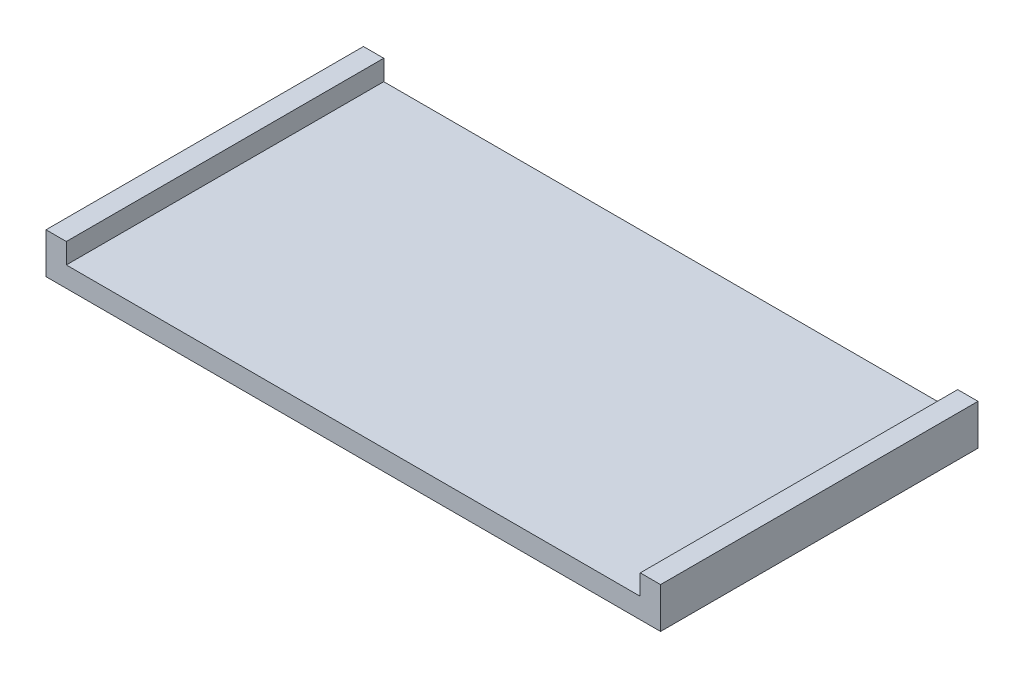
ISO-10303-21;
HEADER;
FILE_DESCRIPTION(('STEP AP214'),'2;1');
FILE_NAME('part.step','',(''),(''),'','','');
FILE_SCHEMA(('AUTOMOTIVE_DESIGN { 1 0 10303 214 1 1 1 1 }'));
ENDSEC;
DATA;
#1=APPLICATION_CONTEXT('core data for automotive mechanical design processes');
#2=APPLICATION_PROTOCOL_DEFINITION('international standard','automotive_design',2000,#1);
#3=PRODUCT_CONTEXT('',#1,'mechanical');
#4=PRODUCT('Part','Part','',(#3));
#5=PRODUCT_RELATED_PRODUCT_CATEGORY('part','',(#4));
#6=PRODUCT_DEFINITION_FORMATION('','',#4);
#7=PRODUCT_DEFINITION_CONTEXT('part definition',#1,'design');
#8=PRODUCT_DEFINITION('design','',#6,#7);
#9=PRODUCT_DEFINITION_SHAPE('','',#8);
#10=(LENGTH_UNIT() NAMED_UNIT(*) SI_UNIT(.MILLI.,.METRE.));
#11=(NAMED_UNIT(*) PLANE_ANGLE_UNIT() SI_UNIT($,.RADIAN.));
#12=(NAMED_UNIT(*) SI_UNIT($,.STERADIAN.) SOLID_ANGLE_UNIT());
#13=UNCERTAINTY_MEASURE_WITH_UNIT(LENGTH_MEASURE(1.E-05),#10,'distance_accuracy_value','');
#14=(GEOMETRIC_REPRESENTATION_CONTEXT(3) GLOBAL_UNCERTAINTY_ASSIGNED_CONTEXT((#13)) GLOBAL_UNIT_ASSIGNED_CONTEXT((#10,
#11,#12)) REPRESENTATION_CONTEXT('',''));
#15=CARTESIAN_POINT('',(0.,0.,0.));
#16=DIRECTION('',(0.,0.,1.));
#17=DIRECTION('',(1.,0.,0.));
#18=AXIS2_PLACEMENT_3D('',#15,#16,#17);
#19=CARTESIAN_POINT('',(-24.2,1.6,0.));
#20=DIRECTION('',(0.,-1.,0.));
#21=DIRECTION('',(0.,0.,-1.));
#22=AXIS2_PLACEMENT_3D('',#19,#20,#21);
#23=PLANE('',#22);
#24=DIRECTION('',(0.,0.,1.));
#25=VECTOR('',#24,1.);
#26=CARTESIAN_POINT('',(22.6,1.6,0.));
#27=LINE('',#26,#25);
#28=CARTESIAN_POINT('',(22.6,1.6,-25.));
#29=VERTEX_POINT('',#28);
#30=CARTESIAN_POINT('',(22.6,1.6,0.));
#31=VERTEX_POINT('',#30);
#32=EDGE_CURVE('E119',#29,#31,#27,.T.);
#33=ORIENTED_EDGE('',*,*,#32,.F.);
#34=DIRECTION('',(-1.,0.,0.));
#35=VECTOR('',#34,1.);
#36=CARTESIAN_POINT('',(-24.2,1.6,-25.));
#37=LINE('',#36,#35);
#38=CARTESIAN_POINT('',(-22.6,1.6,-25.));
#39=VERTEX_POINT('',#38);
#40=EDGE_CURVE('E37',#29,#39,#37,.T.);
#41=ORIENTED_EDGE('',*,*,#40,.T.);
#42=DIRECTION('',(0.,0.,-1.));
#43=VECTOR('',#42,1.);
#44=CARTESIAN_POINT('',(-22.6,1.6,-25.));
#45=LINE('',#44,#43);
#46=CARTESIAN_POINT('',(-22.6,1.6,0.));
#47=VERTEX_POINT('',#46);
#48=EDGE_CURVE('E56',#47,#39,#45,.T.);
#49=ORIENTED_EDGE('',*,*,#48,.F.);
#50=DIRECTION('',(1.,0.,0.));
#51=VECTOR('',#50,1.);
#52=CARTESIAN_POINT('',(0.,1.6,0.));
#53=LINE('',#52,#51);
#54=EDGE_CURVE('E51',#47,#31,#53,.T.);
#55=ORIENTED_EDGE('',*,*,#54,.T.);
#56=EDGE_LOOP('',(#33,#41,#49,#55));
#57=FACE_BOUND('',#56,.T.);
#58=ADVANCED_FACE('F33',(#57),#23,.F.);
#59=CARTESIAN_POINT('',(0.,1.6,0.));
#60=DIRECTION('',(0.,0.,-1.));
#61=DIRECTION('',(-1.,0.,0.));
#62=AXIS2_PLACEMENT_3D('',#59,#60,#61);
#63=PLANE('',#62);
#64=DIRECTION('',(1.,0.,0.));
#65=VECTOR('',#64,1.);
#66=CARTESIAN_POINT('',(0.,0.,0.));
#67=LINE('',#66,#65);
#68=CARTESIAN_POINT('',(-24.2,0.,0.));
#69=VERTEX_POINT('',#68);
#70=CARTESIAN_POINT('',(24.2,0.,0.));
#71=VERTEX_POINT('',#70);
#72=EDGE_CURVE('E104',#69,#71,#67,.T.);
#73=ORIENTED_EDGE('',*,*,#72,.T.);
#74=DIRECTION('',(0.,-1.,0.));
#75=VECTOR('',#74,1.);
#76=CARTESIAN_POINT('',(24.2,1.6,0.));
#77=LINE('',#76,#75);
#78=CARTESIAN_POINT('',(24.2,3.2,0.));
#79=VERTEX_POINT('',#78);
#80=EDGE_CURVE('E11',#79,#71,#77,.T.);
#81=ORIENTED_EDGE('',*,*,#80,.F.);
#82=DIRECTION('',(1.,0.,0.));
#83=VECTOR('',#82,1.);
#84=CARTESIAN_POINT('',(24.2,3.2,0.));
#85=LINE('',#84,#83);
#86=CARTESIAN_POINT('',(22.6,3.2,0.));
#87=VERTEX_POINT('',#86);
#88=EDGE_CURVE('E102',#87,#79,#85,.T.);
#89=ORIENTED_EDGE('',*,*,#88,.F.);
#90=DIRECTION('',(0.,-1.,0.));
#91=VECTOR('',#90,1.);
#92=CARTESIAN_POINT('',(22.6,3.2,0.));
#93=LINE('',#92,#91);
#94=EDGE_CURVE('E124',#87,#31,#93,.T.);
#95=ORIENTED_EDGE('',*,*,#94,.T.);
#96=ORIENTED_EDGE('',*,*,#54,.F.);
#97=DIRECTION('',(0.,-1.,0.));
#98=VECTOR('',#97,1.);
#99=CARTESIAN_POINT('',(-22.6,3.2,0.));
#100=LINE('',#99,#98);
#101=CARTESIAN_POINT('',(-22.6,3.2,0.));
#102=VERTEX_POINT('',#101);
#103=EDGE_CURVE('E149',#102,#47,#100,.T.);
#104=ORIENTED_EDGE('',*,*,#103,.F.);
#105=DIRECTION('',(1.,0.,0.));
#106=VECTOR('',#105,1.);
#107=CARTESIAN_POINT('',(-22.6,3.2,0.));
#108=LINE('',#107,#106);
#109=CARTESIAN_POINT('',(-24.2,3.2,0.));
#110=VERTEX_POINT('',#109);
#111=EDGE_CURVE('E136',#110,#102,#108,.T.);
#112=ORIENTED_EDGE('',*,*,#111,.F.);
#113=DIRECTION('',(0.,-1.,0.));
#114=VECTOR('',#113,1.);
#115=CARTESIAN_POINT('',(-24.2,1.6,0.));
#116=LINE('',#115,#114);
#117=EDGE_CURVE('E167',#110,#69,#116,.T.);
#118=ORIENTED_EDGE('',*,*,#117,.T.);
#119=EDGE_LOOP('',(#73,#81,#89,#95,#96,#104,#112,#118));
#120=FACE_BOUND('',#119,.T.);
#121=ADVANCED_FACE('F35',(#120),#63,.F.);
#122=CARTESIAN_POINT('',(24.2,1.6,-25.));
#123=DIRECTION('',(-1.,0.,0.));
#124=DIRECTION('',(0.,0.,1.));
#125=AXIS2_PLACEMENT_3D('',#122,#123,#124);
#126=PLANE('',#125);
#127=DIRECTION('',(0.,0.,-1.));
#128=VECTOR('',#127,1.);
#129=CARTESIAN_POINT('',(24.2,0.,-25.));
#130=LINE('',#129,#128);
#131=CARTESIAN_POINT('',(24.2,0.,-25.));
#132=VERTEX_POINT('',#131);
#133=EDGE_CURVE('E157',#71,#132,#130,.T.);
#134=ORIENTED_EDGE('',*,*,#133,.T.);
#135=DIRECTION('',(0.,-1.,0.));
#136=VECTOR('',#135,1.);
#137=CARTESIAN_POINT('',(24.2,1.6,-25.));
#138=LINE('',#137,#136);
#139=CARTESIAN_POINT('',(24.2,3.2,-25.));
#140=VERTEX_POINT('',#139);
#141=EDGE_CURVE('E43',#140,#132,#138,.T.);
#142=ORIENTED_EDGE('',*,*,#141,.F.);
#143=DIRECTION('',(0.,0.,-1.));
#144=VECTOR('',#143,1.);
#145=CARTESIAN_POINT('',(24.2,3.2,0.));
#146=LINE('',#145,#144);
#147=EDGE_CURVE('E108',#79,#140,#146,.T.);
#148=ORIENTED_EDGE('',*,*,#147,.F.);
#149=ORIENTED_EDGE('',*,*,#80,.T.);
#150=EDGE_LOOP('',(#134,#142,#148,#149));
#151=FACE_BOUND('',#150,.T.);
#152=ADVANCED_FACE('F109',(#151),#126,.F.);
#153=CARTESIAN_POINT('',(-24.2,1.6,-25.));
#154=DIRECTION('',(0.,0.,1.));
#155=DIRECTION('',(1.,0.,0.));
#156=AXIS2_PLACEMENT_3D('',#153,#154,#155);
#157=PLANE('',#156);
#158=DIRECTION('',(-1.,0.,0.));
#159=VECTOR('',#158,1.);
#160=CARTESIAN_POINT('',(-24.2,0.,-25.));
#161=LINE('',#160,#159);
#162=CARTESIAN_POINT('',(-24.2,0.,-25.));
#163=VERTEX_POINT('',#162);
#164=EDGE_CURVE('E159',#132,#163,#161,.T.);
#165=ORIENTED_EDGE('',*,*,#164,.T.);
#166=DIRECTION('',(0.,-1.,0.));
#167=VECTOR('',#166,1.);
#168=CARTESIAN_POINT('',(-24.2,1.6,-25.));
#169=LINE('',#168,#167);
#170=CARTESIAN_POINT('',(-24.2,3.2,-25.));
#171=VERTEX_POINT('',#170);
#172=EDGE_CURVE('E169',#171,#163,#169,.T.);
#173=ORIENTED_EDGE('',*,*,#172,.F.);
#174=DIRECTION('',(-1.,0.,0.));
#175=VECTOR('',#174,1.);
#176=CARTESIAN_POINT('',(-24.2,3.2,-25.));
#177=LINE('',#176,#175);
#178=CARTESIAN_POINT('',(-22.6,3.2,-25.));
#179=VERTEX_POINT('',#178);
#180=EDGE_CURVE('E130',#179,#171,#177,.T.);
#181=ORIENTED_EDGE('',*,*,#180,.F.);
#182=DIRECTION('',(0.,-1.,0.));
#183=VECTOR('',#182,1.);
#184=CARTESIAN_POINT('',(-22.6,3.2,-25.));
#185=LINE('',#184,#183);
#186=EDGE_CURVE('E140',#179,#39,#185,.T.);
#187=ORIENTED_EDGE('',*,*,#186,.T.);
#188=ORIENTED_EDGE('',*,*,#40,.F.);
#189=DIRECTION('',(0.,-1.,0.));
#190=VECTOR('',#189,1.);
#191=CARTESIAN_POINT('',(22.6,3.2,-25.));
#192=LINE('',#191,#190);
#193=CARTESIAN_POINT('',(22.6,3.2,-25.));
#194=VERTEX_POINT('',#193);
#195=EDGE_CURVE('E127',#194,#29,#192,.T.);
#196=ORIENTED_EDGE('',*,*,#195,.F.);
#197=DIRECTION('',(-1.,0.,0.));
#198=VECTOR('',#197,1.);
#199=CARTESIAN_POINT('',(22.6,3.2,-25.));
#200=LINE('',#199,#198);
#201=EDGE_CURVE('E113',#140,#194,#200,.T.);
#202=ORIENTED_EDGE('',*,*,#201,.F.);
#203=ORIENTED_EDGE('',*,*,#141,.T.);
#204=EDGE_LOOP('',(#165,#173,#181,#187,#188,#196,#202,#203));
#205=FACE_BOUND('',#204,.T.);
#206=ADVANCED_FACE('F174',(#205),#157,.F.);
#207=CARTESIAN_POINT('',(-24.2,1.6,0.));
#208=DIRECTION('',(1.,0.,0.));
#209=DIRECTION('',(0.,0.,-1.));
#210=AXIS2_PLACEMENT_3D('',#207,#208,#209);
#211=PLANE('',#210);
#212=DIRECTION('',(0.,0.,1.));
#213=VECTOR('',#212,1.);
#214=CARTESIAN_POINT('',(-24.2,0.,0.));
#215=LINE('',#214,#213);
#216=EDGE_CURVE('E164',#163,#69,#215,.T.);
#217=ORIENTED_EDGE('',*,*,#216,.T.);
#218=ORIENTED_EDGE('',*,*,#117,.F.);
#219=DIRECTION('',(0.,0.,1.));
#220=VECTOR('',#219,1.);
#221=CARTESIAN_POINT('',(-24.2,3.2,-25.));
#222=LINE('',#221,#220);
#223=EDGE_CURVE('E133',#171,#110,#222,.T.);
#224=ORIENTED_EDGE('',*,*,#223,.F.);
#225=ORIENTED_EDGE('',*,*,#172,.T.);
#226=EDGE_LOOP('',(#217,#218,#224,#225));
#227=FACE_BOUND('',#226,.T.);
#228=ADVANCED_FACE('F180',(#227),#211,.F.);
#229=CARTESIAN_POINT('',(-24.2,0.,0.));
#230=DIRECTION('',(0.,-1.,0.));
#231=DIRECTION('',(0.,0.,-1.));
#232=AXIS2_PLACEMENT_3D('',#229,#230,#231);
#233=PLANE('',#232);
#234=ORIENTED_EDGE('',*,*,#72,.F.);
#235=ORIENTED_EDGE('',*,*,#216,.F.);
#236=ORIENTED_EDGE('',*,*,#164,.F.);
#237=ORIENTED_EDGE('',*,*,#133,.F.);
#238=EDGE_LOOP('',(#234,#235,#236,#237));
#239=FACE_BOUND('',#238,.T.);
#240=ADVANCED_FACE('F178',(#239),#233,.T.);
#241=CARTESIAN_POINT('',(-22.6,3.2,-25.));
#242=DIRECTION('',(-1.,0.,0.));
#243=DIRECTION('',(0.,0.,1.));
#244=AXIS2_PLACEMENT_3D('',#241,#242,#243);
#245=PLANE('',#244);
#246=ORIENTED_EDGE('',*,*,#48,.T.);
#247=ORIENTED_EDGE('',*,*,#186,.F.);
#248=DIRECTION('',(0.,0.,-1.));
#249=VECTOR('',#248,1.);
#250=CARTESIAN_POINT('',(-22.6,3.2,-25.));
#251=LINE('',#250,#249);
#252=EDGE_CURVE('E138',#102,#179,#251,.T.);
#253=ORIENTED_EDGE('',*,*,#252,.F.);
#254=ORIENTED_EDGE('',*,*,#103,.T.);
#255=EDGE_LOOP('',(#246,#247,#253,#254));
#256=FACE_BOUND('',#255,.T.);
#257=ADVANCED_FACE('F187',(#256),#245,.F.);
#258=CARTESIAN_POINT('',(-22.6,3.2,-25.));
#259=DIRECTION('',(0.,-1.,0.));
#260=DIRECTION('',(0.,0.,-1.));
#261=AXIS2_PLACEMENT_3D('',#258,#259,#260);
#262=PLANE('',#261);
#263=ORIENTED_EDGE('',*,*,#180,.T.);
#264=ORIENTED_EDGE('',*,*,#223,.T.);
#265=ORIENTED_EDGE('',*,*,#111,.T.);
#266=ORIENTED_EDGE('',*,*,#252,.T.);
#267=EDGE_LOOP('',(#263,#264,#265,#266));
#268=FACE_BOUND('',#267,.T.);
#269=ADVANCED_FACE('F184',(#268),#262,.F.);
#270=CARTESIAN_POINT('',(22.6,3.2,0.));
#271=DIRECTION('',(1.,0.,0.));
#272=DIRECTION('',(0.,0.,-1.));
#273=AXIS2_PLACEMENT_3D('',#270,#271,#272);
#274=PLANE('',#273);
#275=ORIENTED_EDGE('',*,*,#32,.T.);
#276=ORIENTED_EDGE('',*,*,#94,.F.);
#277=DIRECTION('',(0.,0.,1.));
#278=VECTOR('',#277,1.);
#279=CARTESIAN_POINT('',(22.6,3.2,0.));
#280=LINE('',#279,#278);
#281=EDGE_CURVE('E117',#194,#87,#280,.T.);
#282=ORIENTED_EDGE('',*,*,#281,.F.);
#283=ORIENTED_EDGE('',*,*,#195,.T.);
#284=EDGE_LOOP('',(#275,#276,#282,#283));
#285=FACE_BOUND('',#284,.T.);
#286=ADVANCED_FACE('F194',(#285),#274,.F.);
#287=CARTESIAN_POINT('',(22.6,3.2,0.));
#288=DIRECTION('',(0.,-1.,0.));
#289=DIRECTION('',(0.,0.,-1.));
#290=AXIS2_PLACEMENT_3D('',#287,#288,#289);
#291=PLANE('',#290);
#292=ORIENTED_EDGE('',*,*,#88,.T.);
#293=ORIENTED_EDGE('',*,*,#147,.T.);
#294=ORIENTED_EDGE('',*,*,#201,.T.);
#295=ORIENTED_EDGE('',*,*,#281,.T.);
#296=EDGE_LOOP('',(#292,#293,#294,#295));
#297=FACE_BOUND('',#296,.T.);
#298=ADVANCED_FACE('F115',(#297),#291,.F.);
#299=CLOSED_SHELL('',(#58,#121,#152,#206,#228,#240,#257,#269,#286,#298));
#300=MANIFOLD_SOLID_BREP('B2',#299);
#301=ADVANCED_BREP_SHAPE_REPRESENTATION('',(#18,#300),#14);
#302=SHAPE_DEFINITION_REPRESENTATION(#9,#301);
ENDSEC;
END-ISO-10303-21;
